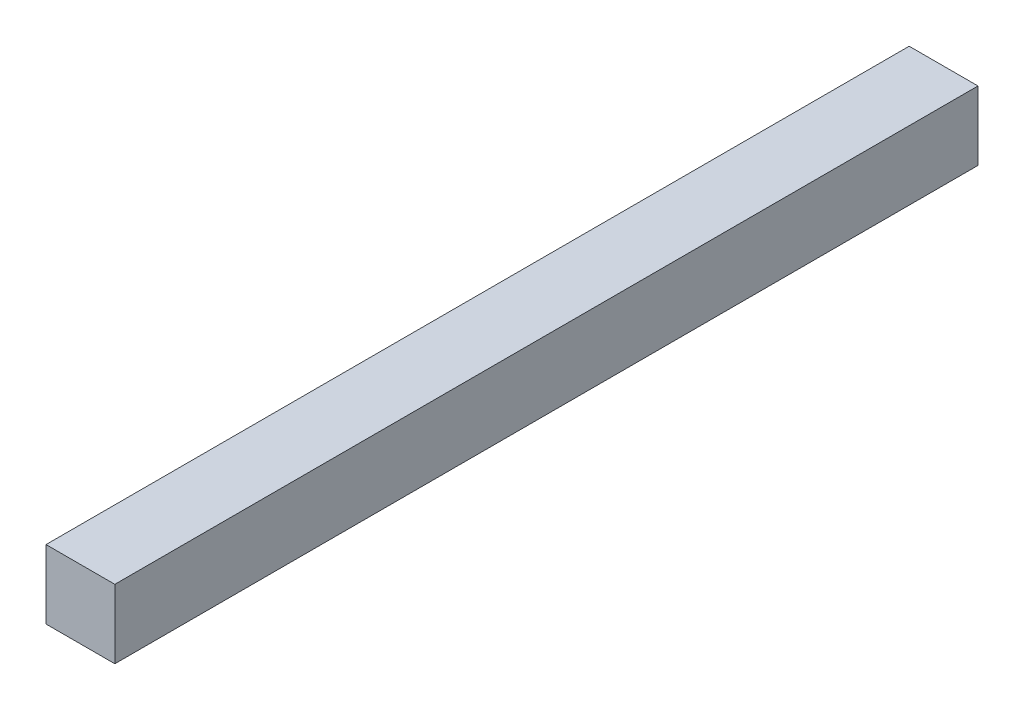
ISO-10303-21;
HEADER;
FILE_DESCRIPTION(('STEP AP214'),'2;1');
FILE_NAME('part.step','',(''),(''),'','','');
FILE_SCHEMA(('AUTOMOTIVE_DESIGN { 1 0 10303 214 1 1 1 1 }'));
ENDSEC;
DATA;
#1=APPLICATION_CONTEXT('core data for automotive mechanical design processes');
#2=APPLICATION_PROTOCOL_DEFINITION('international standard','automotive_design',2000,#1);
#3=PRODUCT_CONTEXT('',#1,'mechanical');
#4=PRODUCT('Part','Part','',(#3));
#5=PRODUCT_RELATED_PRODUCT_CATEGORY('part','',(#4));
#6=PRODUCT_DEFINITION_FORMATION('','',#4);
#7=PRODUCT_DEFINITION_CONTEXT('part definition',#1,'design');
#8=PRODUCT_DEFINITION('design','',#6,#7);
#9=PRODUCT_DEFINITION_SHAPE('','',#8);
#10=(LENGTH_UNIT() NAMED_UNIT(*) SI_UNIT(.MILLI.,.METRE.));
#11=(NAMED_UNIT(*) PLANE_ANGLE_UNIT() SI_UNIT($,.RADIAN.));
#12=(NAMED_UNIT(*) SI_UNIT($,.STERADIAN.) SOLID_ANGLE_UNIT());
#13=UNCERTAINTY_MEASURE_WITH_UNIT(LENGTH_MEASURE(1.E-05),#10,'distance_accuracy_value','');
#14=(GEOMETRIC_REPRESENTATION_CONTEXT(3) GLOBAL_UNCERTAINTY_ASSIGNED_CONTEXT((#13)) GLOBAL_UNIT_ASSIGNED_CONTEXT((#10,
#11,#12)) REPRESENTATION_CONTEXT('',''));
#15=CARTESIAN_POINT('',(0.,0.,0.));
#16=DIRECTION('',(0.,0.,1.));
#17=DIRECTION('',(1.,0.,0.));
#18=AXIS2_PLACEMENT_3D('',#15,#16,#17);
#19=CARTESIAN_POINT('',(-25.,25.,627.));
#20=DIRECTION('',(1.,0.,0.));
#21=DIRECTION('',(0.,1.,0.));
#22=AXIS2_PLACEMENT_3D('',#19,#20,#21);
#23=PLANE('',#22);
#24=DIRECTION('',(0.,-1.,0.));
#25=VECTOR('',#24,1.);
#26=CARTESIAN_POINT('',(-25.,25.,0.));
#27=LINE('',#26,#25);
#28=CARTESIAN_POINT('',(-25.,25.,0.));
#29=VERTEX_POINT('',#28);
#30=CARTESIAN_POINT('',(-25.,-25.,0.));
#31=VERTEX_POINT('',#30);
#32=EDGE_CURVE('E95',#29,#31,#27,.T.);
#33=ORIENTED_EDGE('',*,*,#32,.T.);
#34=DIRECTION('',(0.,0.,-1.));
#35=VECTOR('',#34,1.);
#36=CARTESIAN_POINT('',(-25.,-25.,627.));
#37=LINE('',#36,#35);
#38=CARTESIAN_POINT('',(-25.,-25.,627.));
#39=VERTEX_POINT('',#38);
#40=EDGE_CURVE('E11',#39,#31,#37,.T.);
#41=ORIENTED_EDGE('',*,*,#40,.F.);
#42=DIRECTION('',(0.,-1.,0.));
#43=VECTOR('',#42,1.);
#44=CARTESIAN_POINT('',(-25.,25.,627.));
#45=LINE('',#44,#43);
#46=CARTESIAN_POINT('',(-25.,25.,627.));
#47=VERTEX_POINT('',#46);
#48=EDGE_CURVE('E83',#47,#39,#45,.T.);
#49=ORIENTED_EDGE('',*,*,#48,.F.);
#50=DIRECTION('',(0.,0.,-1.));
#51=VECTOR('',#50,1.);
#52=CARTESIAN_POINT('',(-25.,25.,627.));
#53=LINE('',#52,#51);
#54=EDGE_CURVE('E91',#47,#29,#53,.T.);
#55=ORIENTED_EDGE('',*,*,#54,.T.);
#56=EDGE_LOOP('',(#33,#41,#49,#55));
#57=FACE_BOUND('',#56,.T.);
#58=ADVANCED_FACE('F32',(#57),#23,.F.);
#59=CARTESIAN_POINT('',(25.,-25.,627.));
#60=DIRECTION('',(0.,1.,0.));
#61=DIRECTION('',(-1.,0.,0.));
#62=AXIS2_PLACEMENT_3D('',#59,#60,#61);
#63=PLANE('',#62);
#64=DIRECTION('',(1.,0.,0.));
#65=VECTOR('',#64,1.);
#66=CARTESIAN_POINT('',(25.,-25.,0.));
#67=LINE('',#66,#65);
#68=CARTESIAN_POINT('',(25.,-25.,0.));
#69=VERTEX_POINT('',#68);
#70=EDGE_CURVE('E87',#31,#69,#67,.T.);
#71=ORIENTED_EDGE('',*,*,#70,.T.);
#72=DIRECTION('',(0.,0.,-1.));
#73=VECTOR('',#72,1.);
#74=CARTESIAN_POINT('',(25.,-25.,627.));
#75=LINE('',#74,#73);
#76=CARTESIAN_POINT('',(25.,-25.,627.));
#77=VERTEX_POINT('',#76);
#78=EDGE_CURVE('E40',#77,#69,#75,.T.);
#79=ORIENTED_EDGE('',*,*,#78,.F.);
#80=DIRECTION('',(1.,0.,0.));
#81=VECTOR('',#80,1.);
#82=CARTESIAN_POINT('',(25.,-25.,627.));
#83=LINE('',#82,#81);
#84=EDGE_CURVE('E78',#39,#77,#83,.T.);
#85=ORIENTED_EDGE('',*,*,#84,.F.);
#86=ORIENTED_EDGE('',*,*,#40,.T.);
#87=EDGE_LOOP('',(#71,#79,#85,#86));
#88=FACE_BOUND('',#87,.T.);
#89=ADVANCED_FACE('F86',(#88),#63,.F.);
#90=CARTESIAN_POINT('',(25.,25.,627.));
#91=DIRECTION('',(-1.,0.,0.));
#92=DIRECTION('',(0.,-1.,0.));
#93=AXIS2_PLACEMENT_3D('',#90,#91,#92);
#94=PLANE('',#93);
#95=DIRECTION('',(0.,1.,0.));
#96=VECTOR('',#95,1.);
#97=CARTESIAN_POINT('',(25.,25.,0.));
#98=LINE('',#97,#96);
#99=CARTESIAN_POINT('',(25.,25.,0.));
#100=VERTEX_POINT('',#99);
#101=EDGE_CURVE('E65',#69,#100,#98,.T.);
#102=ORIENTED_EDGE('',*,*,#101,.T.);
#103=DIRECTION('',(0.,0.,-1.));
#104=VECTOR('',#103,1.);
#105=CARTESIAN_POINT('',(25.,25.,627.));
#106=LINE('',#105,#104);
#107=CARTESIAN_POINT('',(25.,25.,627.));
#108=VERTEX_POINT('',#107);
#109=EDGE_CURVE('E88',#108,#100,#106,.T.);
#110=ORIENTED_EDGE('',*,*,#109,.F.);
#111=DIRECTION('',(0.,1.,0.));
#112=VECTOR('',#111,1.);
#113=CARTESIAN_POINT('',(25.,25.,627.));
#114=LINE('',#113,#112);
#115=EDGE_CURVE('E81',#77,#108,#114,.T.);
#116=ORIENTED_EDGE('',*,*,#115,.F.);
#117=ORIENTED_EDGE('',*,*,#78,.T.);
#118=EDGE_LOOP('',(#102,#110,#116,#117));
#119=FACE_BOUND('',#118,.T.);
#120=ADVANCED_FACE('F89',(#119),#94,.F.);
#121=CARTESIAN_POINT('',(25.,25.,627.));
#122=DIRECTION('',(0.,-1.,0.));
#123=DIRECTION('',(1.,0.,0.));
#124=AXIS2_PLACEMENT_3D('',#121,#122,#123);
#125=PLANE('',#124);
#126=DIRECTION('',(-1.,0.,0.));
#127=VECTOR('',#126,1.);
#128=CARTESIAN_POINT('',(25.,25.,0.));
#129=LINE('',#128,#127);
#130=EDGE_CURVE('E71',#100,#29,#129,.T.);
#131=ORIENTED_EDGE('',*,*,#130,.T.);
#132=ORIENTED_EDGE('',*,*,#54,.F.);
#133=DIRECTION('',(-1.,0.,0.));
#134=VECTOR('',#133,1.);
#135=CARTESIAN_POINT('',(25.,25.,627.));
#136=LINE('',#135,#134);
#137=EDGE_CURVE('E48',#108,#47,#136,.T.);
#138=ORIENTED_EDGE('',*,*,#137,.F.);
#139=ORIENTED_EDGE('',*,*,#109,.T.);
#140=EDGE_LOOP('',(#131,#132,#138,#139));
#141=FACE_BOUND('',#140,.T.);
#142=ADVANCED_FACE('F103',(#141),#125,.F.);
#143=CARTESIAN_POINT('',(0.,0.,627.));
#144=DIRECTION('',(0.,0.,-1.));
#145=DIRECTION('',(-1.,0.,0.));
#146=AXIS2_PLACEMENT_3D('',#143,#144,#145);
#147=PLANE('',#146);
#148=ORIENTED_EDGE('',*,*,#48,.T.);
#149=ORIENTED_EDGE('',*,*,#84,.T.);
#150=ORIENTED_EDGE('',*,*,#115,.T.);
#151=ORIENTED_EDGE('',*,*,#137,.T.);
#152=EDGE_LOOP('',(#148,#149,#150,#151));
#153=FACE_BOUND('',#152,.T.);
#154=ADVANCED_FACE('F79',(#153),#147,.F.);
#155=CARTESIAN_POINT('',(0.,0.,0.));
#156=DIRECTION('',(0.,0.,-1.));
#157=DIRECTION('',(-1.,0.,0.));
#158=AXIS2_PLACEMENT_3D('',#155,#156,#157);
#159=PLANE('',#158);
#160=CARTESIAN_POINT('',(0.,0.,0.));
#161=DIRECTION('',(0.,0.,1.));
#162=DIRECTION('',(1.,0.,0.));
#163=AXIS2_PLACEMENT_3D('',#160,#161,#162);
#164=CIRCLE('',#163,5.);
#165=CARTESIAN_POINT('',(5.,0.,0.));
#166=VERTEX_POINT('',#165);
#167=EDGE_CURVE('E109',#166,#166,#164,.T.);
#168=ORIENTED_EDGE('',*,*,#167,.T.);
#169=EDGE_LOOP('',(#168));
#170=FACE_BOUND('',#169,.T.);
#171=ORIENTED_EDGE('',*,*,#32,.F.);
#172=ORIENTED_EDGE('',*,*,#130,.F.);
#173=ORIENTED_EDGE('',*,*,#101,.F.);
#174=ORIENTED_EDGE('',*,*,#70,.F.);
#175=EDGE_LOOP('',(#171,#172,#173,#174));
#176=FACE_BOUND('',#175,.T.);
#177=ADVANCED_FACE('F106',(#170,#176),#159,.T.);
#178=CARTESIAN_POINT('',(0.,0.,22.));
#179=DIRECTION('',(0.,0.,-1.));
#180=DIRECTION('',(-1.,0.,0.));
#181=AXIS2_PLACEMENT_3D('',#178,#179,#180);
#182=CYLINDRICAL_SURFACE('',#181,5.);
#183=CARTESIAN_POINT('',(0.,0.,22.));
#184=DIRECTION('',(0.,0.,1.));
#185=DIRECTION('',(1.,0.,0.));
#186=AXIS2_PLACEMENT_3D('',#183,#184,#185);
#187=CIRCLE('',#186,5.);
#188=CARTESIAN_POINT('',(5.,0.,22.));
#189=VERTEX_POINT('',#188);
#190=EDGE_CURVE('E98',#189,#189,#187,.T.);
#191=ORIENTED_EDGE('',*,*,#190,.T.);
#192=EDGE_LOOP('',(#191));
#193=FACE_BOUND('',#192,.T.);
#194=ORIENTED_EDGE('',*,*,#167,.F.);
#195=EDGE_LOOP('',(#194));
#196=FACE_BOUND('',#195,.T.);
#197=ADVANCED_FACE('F115',(#193,#196),#182,.F.);
#198=CARTESIAN_POINT('',(0.,0.,22.));
#199=DIRECTION('',(0.,0.,1.));
#200=DIRECTION('',(1.,0.,0.));
#201=AXIS2_PLACEMENT_3D('',#198,#199,#200);
#202=PLANE('',#201);
#203=ORIENTED_EDGE('',*,*,#190,.F.);
#204=EDGE_LOOP('',(#203));
#205=FACE_BOUND('',#204,.T.);
#206=ADVANCED_FACE('F118',(#205),#202,.F.);
#207=CLOSED_SHELL('',(#58,#89,#120,#142,#154,#177,#197,#206));
#208=MANIFOLD_SOLID_BREP('B2',#207);
#209=ADVANCED_BREP_SHAPE_REPRESENTATION('',(#18,#208),#14);
#210=SHAPE_DEFINITION_REPRESENTATION(#9,#209);
ENDSEC;
END-ISO-10303-21;
